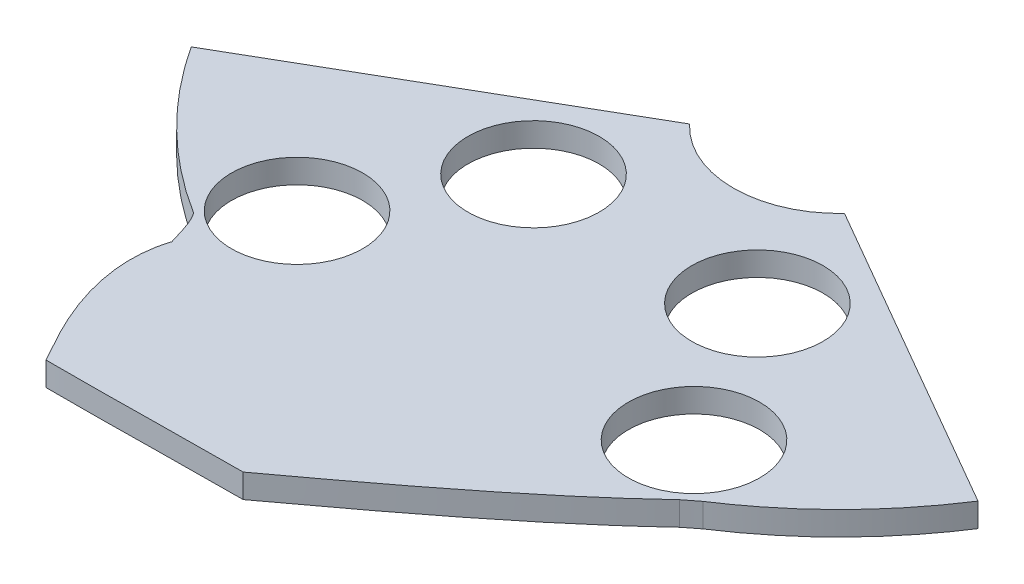
ISO-10303-21;
HEADER;
FILE_DESCRIPTION(('STEP AP214'),'2;1');
FILE_NAME('part.step','',(''),(''),'','','');
FILE_SCHEMA(('AUTOMOTIVE_DESIGN { 1 0 10303 214 1 1 1 1 }'));
ENDSEC;
DATA;
#1=APPLICATION_CONTEXT('core data for automotive mechanical design processes');
#2=APPLICATION_PROTOCOL_DEFINITION('international standard','automotive_design',2000,#1);
#3=PRODUCT_CONTEXT('',#1,'mechanical');
#4=PRODUCT('Part','Part','',(#3));
#5=PRODUCT_RELATED_PRODUCT_CATEGORY('part','',(#4));
#6=PRODUCT_DEFINITION_FORMATION('','',#4);
#7=PRODUCT_DEFINITION_CONTEXT('part definition',#1,'design');
#8=PRODUCT_DEFINITION('design','',#6,#7);
#9=PRODUCT_DEFINITION_SHAPE('','',#8);
#10=(LENGTH_UNIT() NAMED_UNIT(*) SI_UNIT(.MILLI.,.METRE.));
#11=(NAMED_UNIT(*) PLANE_ANGLE_UNIT() SI_UNIT($,.RADIAN.));
#12=(NAMED_UNIT(*) SI_UNIT($,.STERADIAN.) SOLID_ANGLE_UNIT());
#13=UNCERTAINTY_MEASURE_WITH_UNIT(LENGTH_MEASURE(1.E-05),#10,'distance_accuracy_value','');
#14=(GEOMETRIC_REPRESENTATION_CONTEXT(3) GLOBAL_UNCERTAINTY_ASSIGNED_CONTEXT((#13)) GLOBAL_UNIT_ASSIGNED_CONTEXT((#10,
#11,#12)) REPRESENTATION_CONTEXT('',''));
#15=CARTESIAN_POINT('',(0.,0.,0.));
#16=DIRECTION('',(0.,0.,1.));
#17=DIRECTION('',(1.,0.,0.));
#18=AXIS2_PLACEMENT_3D('',#15,#16,#17);
#19=CARTESIAN_POINT('',(-55.0520473472876,-87.736,55.9596318236398));
#20=DIRECTION('',(0.,-1.,0.));
#21=DIRECTION('',(0.,0.,-1.));
#22=AXIS2_PLACEMENT_3D('',#19,#20,#21);
#23=PLANE('',#22);
#24=CARTESIAN_POINT('',(18.75,-87.736,32.476));
#25=DIRECTION('',(0.,-1.,0.));
#26=DIRECTION('',(0.,0.,-1.));
#27=AXIS2_PLACEMENT_3D('',#24,#25,#26);
#28=CIRCLE('',#27,10.999845998306);
#29=CARTESIAN_POINT('',(18.75,-87.736,21.476154001694));
#30=VERTEX_POINT('',#29);
#31=EDGE_CURVE('E441',#30,#30,#28,.T.);
#32=ORIENTED_EDGE('',*,*,#31,.F.);
#33=EDGE_LOOP('',(#32));
#34=FACE_BOUND('',#33,.T.);
#35=CARTESIAN_POINT('',(-33.25,-87.736,57.591));
#36=DIRECTION('',(0.,-1.,0.));
#37=DIRECTION('',(0.,0.,-1.));
#38=AXIS2_PLACEMENT_3D('',#35,#36,#37);
#39=CIRCLE('',#38,10.999845998306);
#40=CARTESIAN_POINT('',(-33.25,-87.736,46.591154001694));
#41=VERTEX_POINT('',#40);
#42=EDGE_CURVE('E422',#41,#41,#39,.T.);
#43=ORIENTED_EDGE('',*,*,#42,.F.);
#44=EDGE_LOOP('',(#43));
#45=FACE_BOUND('',#44,.T.);
#46=CARTESIAN_POINT('',(-65.8942438215736,-87.736,42.6629141284689));
#47=CARTESIAN_POINT('',(-64.3363717966949,-87.736,45.0682384546903));
#48=CARTESIAN_POINT('',(-62.6479617907851,-87.736,47.389191956751));
#49=CARTESIAN_POINT('',(-59.0277869117494,-87.736,51.8287368815208));
#50=CARTESIAN_POINT('',(-57.0946274292506,-87.736,53.9500653699306));
#51=CARTESIAN_POINT('',(-50.9669001434117,-87.736,59.9787519804776));
#52=CARTESIAN_POINT('',(-46.4412354467479,-87.736,63.5473498690072));
#53=CARTESIAN_POINT('',(-41.5808535684729,-87.736,66.5829540394576));
#54=B_SPLINE_CURVE_WITH_KNOTS('',3,(#46,#47,#48,#49,#50,#51,#52,#53),.UNSPECIFIED.,.F.,.F.,(4,2,
2,4),(1.58623522583667E-06,0.250001586235226,0.500001586235226,1.),.UNSPECIFIED.);
#55=CARTESIAN_POINT('',(-41.5808535687203,-87.736,66.5829540398534));
#56=VERTEX_POINT('',#55);
#57=CARTESIAN_POINT('',(-65.8942438215736,-87.736,42.6629141284689));
#58=VERTEX_POINT('',#57);
#59=EDGE_CURVE('E378',#56,#58,#54,.F.);
#60=ORIENTED_EDGE('',*,*,#59,.T.);
#61=DIRECTION('',(0.866025113443951,0.,-0.500000502884139));
#62=VECTOR('',#61,1.);
#63=CARTESIAN_POINT('',(-65.8942438215736,-87.736,42.6629141284689));
#64=LINE('',#63,#62);
#65=CARTESIAN_POINT('',(-12.9766531358799,-87.736,12.1108879302399));
#66=VERTEX_POINT('',#65);
#67=EDGE_CURVE('E103',#58,#66,#64,.T.);
#68=ORIENTED_EDGE('',*,*,#67,.T.);
#69=CARTESIAN_POINT('',(0.,-87.736,0.));
#70=DIRECTION('',(0.,1.,0.));
#71=DIRECTION('',(0.,0.,-1.));
#72=AXIS2_PLACEMENT_3D('',#69,#70,#71);
#73=CIRCLE('',#72,17.7501305084715);
#74=CARTESIAN_POINT('',(12.9766531358511,-87.736,12.1108879302707));
#75=VERTEX_POINT('',#74);
#76=EDGE_CURVE('E272',#66,#75,#73,.T.);
#77=ORIENTED_EDGE('',*,*,#76,.T.);
#78=DIRECTION('',(0.866025113442766,0.,0.500000502886192));
#79=VECTOR('',#78,1.);
#80=CARTESIAN_POINT('',(12.9766531358511,-87.736,12.1108879302707));
#81=LINE('',#80,#79);
#82=CARTESIAN_POINT('',(65.8946490574718,-87.736,42.6631480920524));
#83=VERTEX_POINT('',#82);
#84=EDGE_CURVE('E249',#75,#83,#81,.T.);
#85=ORIENTED_EDGE('',*,*,#84,.T.);
#86=CARTESIAN_POINT('',(42.8828039857901,-87.736,65.7521102612512));
#87=CARTESIAN_POINT('',(45.1737617508951,-87.736,64.2582041185947));
#88=CARTESIAN_POINT('',(47.3877951781587,-87.736,62.6417764447803));
#89=CARTESIAN_POINT('',(51.6362570394499,-87.736,59.1896560975365));
#90=CARTESIAN_POINT('',(53.6692311857068,-87.736,57.3534712630623));
#91=CARTESIAN_POINT('',(59.4648172289766,-87.736,51.5394550472412));
#92=CARTESIAN_POINT('',(62.9203197673447,-87.736,47.2575045112625));
#93=CARTESIAN_POINT('',(65.8946490574718,-87.736,42.6631480920524));
#94=B_SPLINE_CURVE_WITH_KNOTS('',3,(#86,#87,#88,#89,#90,#91,#92,#93),.UNSPECIFIED.,.F.,.F.,(4,2,
2,4),(0.,0.25,0.5,1.),.UNSPECIFIED.);
#95=CARTESIAN_POINT('',(42.8828039857901,-87.736,65.7521102612512));
#96=VERTEX_POINT('',#95);
#97=EDGE_CURVE('E244',#83,#96,#94,.F.);
#98=ORIENTED_EDGE('',*,*,#97,.T.);
#99=CARTESIAN_POINT('',(40.7004704810684,-87.736,67.4575422626576));
#100=CARTESIAN_POINT('',(40.8867616398878,-87.736,67.3087391992329));
#101=CARTESIAN_POINT('',(41.2496543915723,-87.736,67.0188754356988));
#102=CARTESIAN_POINT('',(41.7979280683242,-87.736,66.5881386882111));
#103=CARTESIAN_POINT('',(42.3385373369795,-87.736,66.1677438511575));
#104=CARTESIAN_POINT('',(42.7031747811597,-87.736,65.889285515214));
#105=CARTESIAN_POINT('',(42.8828036072188,-87.736,65.7521105081207));
#106=B_SPLINE_CURVE_WITH_KNOTS('',3,(#99,#100,#101,#102,#103,#104,#105),.UNSPECIFIED.,.F.,.F.,
(4,1,1,1,4),(0.,0.258173576911872,0.502916972355743,0.754983436937178,0.999720160996087),.UNSPECIFIED.);
#107=CARTESIAN_POINT('',(40.7004704810684,-87.736,67.4575422626577));
#108=VERTEX_POINT('',#107);
#109=EDGE_CURVE('E321',#96,#108,#106,.F.);
#110=ORIENTED_EDGE('',*,*,#109,.T.);
#111=CARTESIAN_POINT('',(0.131067464151984,-87.7359999999999,99.9999693253625));
#112=CARTESIAN_POINT('',(1.51107387595093,-87.7359999999999,98.9848313259104));
#113=CARTESIAN_POINT('',(4.51609838661675,-87.7359999999999,96.7743237920469));
#114=CARTESIAN_POINT('',(8.82690411870411,-87.736,93.5687154434641));
#115=CARTESIAN_POINT('',(12.6236885784628,-87.736,90.7089565437726));
#116=CARTESIAN_POINT('',(15.6690907022038,-87.736,88.385653659053));
#117=CARTESIAN_POINT('',(18.9171375943103,-87.736,85.8803711852998));
#118=CARTESIAN_POINT('',(22.7896384570573,-87.736,82.841797706014));
#119=CARTESIAN_POINT('',(26.4480459632341,-87.736,79.8917970907487));
#120=CARTESIAN_POINT('',(29.3960302704276,-87.736,77.4550232048664));
#121=CARTESIAN_POINT('',(31.6397966991165,-87.736,75.565580219963));
#122=CARTESIAN_POINT('',(33.8721449515672,-87.736,73.6432908249523));
#123=CARTESIAN_POINT('',(35.6436157034548,-87.736,72.0832953923408));
#124=CARTESIAN_POINT('',(36.9680411924613,-87.736,70.8973496369327));
#125=CARTESIAN_POINT('',(37.9477097741701,-87.736,70.010038492036));
#126=CARTESIAN_POINT('',(38.8948023414571,-87.736,69.1421063796165));
#127=CARTESIAN_POINT('',(39.8098411530025,-87.736,68.2945654110852));
#128=CARTESIAN_POINT('',(40.4066282874975,-87.736,67.7336978278344));
#129=CARTESIAN_POINT('',(40.7004704810684,-87.736,67.4575422626577));
#130=B_SPLINE_CURVE_WITH_KNOTS('',3,(#111,#112,#113,#114,#115,#116,#117,#118,#119,#120,#121,
#122,#123,#124,#125,#126,#127,#128,#129),.UNSPECIFIED.,.F.,.F.,(4,1,1,1,1,1,1,1,1,1,1,1,1,1,1,1,
4),(-9.30362142148589E-06,0.0987502902813,0.215044045264264,0.309674643517004,0.372764322258113,
0.435858284457049,0.546143036680816,0.656517674997856,0.706768770349083,0.766626982490989,
0.825614461856991,0.876591601837197,0.902698147445452,0.9280998717604,0.95278792018582,
0.976754052333753,0.999999999999996),.UNSPECIFIED.);
#131=CARTESIAN_POINT('',(0.131067464151832,-87.736,99.9999693253626));
#132=VERTEX_POINT('',#131);
#133=EDGE_CURVE('E129',#108,#132,#130,.F.);
#134=ORIENTED_EDGE('',*,*,#133,.T.);
#135=CARTESIAN_POINT('',(0.131064335761434,-87.736,99.9999693257229));
#136=CARTESIAN_POINT('',(0.087384425976382,-87.736,99.9999743126418));
#137=CARTESIAN_POINT('',(-10.7690040149646,-87.736,100.002511242271));
#138=CARTESIAN_POINT('',(-22.1308541684504,-87.736,100.330427039868));
#139=CARTESIAN_POINT('',(-32.639145671124,-87.736,100.264269814892));
#140=B_SPLINE_CURVE_WITH_KNOTS('',3,(#135,#136,#137,#138,#139),.UNSPECIFIED.,.F.,.F.,(4,1,4),
(0.,0.00402418543561504,1.),.UNSPECIFIED.);
#141=CARTESIAN_POINT('',(-32.639145671124,-87.736,100.264269814892));
#142=VERTEX_POINT('',#141);
#143=EDGE_CURVE('E122',#132,#142,#140,.T.);
#144=ORIENTED_EDGE('',*,*,#143,.T.);
#145=CARTESIAN_POINT('',(-39.2579138546466,-87.736,72.5609008614316));
#146=CARTESIAN_POINT('',(-39.3334243155988,-87.736,72.8026256264214));
#147=CARTESIAN_POINT('',(-39.4847579417553,-87.736,73.2870779113807));
#148=CARTESIAN_POINT('',(-39.6702803341601,-87.736,74.0275991301665));
#149=CARTESIAN_POINT('',(-39.8267682491792,-87.736,74.7785722841445));
#150=CARTESIAN_POINT('',(-39.9517779760452,-87.736,75.5401641651443));
#151=CARTESIAN_POINT('',(-40.1176189518085,-87.736,76.8864325125948));
#152=CARTESIAN_POINT('',(-40.1972551985473,-87.736,78.8684086676542));
#153=CARTESIAN_POINT('',(-40.0491348770359,-87.736,81.0085004298021));
#154=CARTESIAN_POINT('',(-39.8067322982257,-87.736,82.7289881524763));
#155=CARTESIAN_POINT('',(-39.4936561746402,-87.736,84.4197313871119));
#156=CARTESIAN_POINT('',(-38.9728869992772,-87.736,86.5129325568522));
#157=CARTESIAN_POINT('',(-38.1806330891049,-87.736,88.961966327848));
#158=CARTESIAN_POINT('',(-37.4002248556766,-87.736,90.9529070416254));
#159=CARTESIAN_POINT('',(-36.7147243088933,-87.736,92.5152999311266));
#160=CARTESIAN_POINT('',(-35.9917866208589,-87.736,94.0608115741842));
#161=CARTESIAN_POINT('',(-35.0249931111153,-87.736,95.9649297903513));
#162=CARTESIAN_POINT('',(-33.8291369462771,-87.736,98.1525882755385));
#163=CARTESIAN_POINT('',(-33.0242403779927,-87.736,99.580914470401));
#164=CARTESIAN_POINT('',(-32.6391530384934,-87.736,100.264269768448));
#165=B_SPLINE_CURVE_WITH_KNOTS('',3,(#145,#146,#147,#148,#149,#150,#151,#152,#153,#154,#155,
#156,#157,#158,#159,#160,#161,#162,#163,#164),.UNSPECIFIED.,.F.,.F.,(4,1,1,1,1,1,1,1,1,1,1,1,1,
1,1,1,1,4),(0.,0.0259051117965361,0.0519176714200895,0.0780650469227528,0.104370697989442,
0.130853537073552,0.216816719783621,0.306793467340347,0.349936613255063,0.394534777038986,
0.482664537785134,0.570393553242989,0.657709950962907,0.70132092011644,0.744937968127707,
0.832260593511006,0.91974781664861,0.999999082433621),.UNSPECIFIED.);
#166=CARTESIAN_POINT('',(-39.2579138546466,-87.736,72.5609008614316));
#167=VERTEX_POINT('',#166);
#168=EDGE_CURVE('E126',#142,#167,#165,.F.);
#169=ORIENTED_EDGE('',*,*,#168,.T.);
#170=CARTESIAN_POINT('',(-41.5808535687203,-87.736,66.5829540398534));
#171=CARTESIAN_POINT('',(-41.5319872719292,-87.736,66.6558028091556));
#172=CARTESIAN_POINT('',(-41.4353089611126,-87.736,66.7999286468578));
#173=CARTESIAN_POINT('',(-41.2995809981519,-87.736,67.018827268487));
#174=CARTESIAN_POINT('',(-41.1462861887753,-87.736,67.2811092135757));
#175=CARTESIAN_POINT('',(-40.9785526023332,-87.736,67.5935523964576));
#176=CARTESIAN_POINT('',(-40.7476876188367,-87.736,68.0691830135567));
#177=CARTESIAN_POINT('',(-40.4857920797012,-87.736,68.6962659882754));
#178=CARTESIAN_POINT('',(-40.2160589852076,-87.736,69.4655545456486));
#179=CARTESIAN_POINT('',(-39.9718734688118,-87.736,70.2581110771085));
#180=CARTESIAN_POINT('',(-39.7422106096374,-87.736,71.0423321668089));
#181=CARTESIAN_POINT('',(-39.5488207806256,-87.736,71.6845690757876));
#182=CARTESIAN_POINT('',(-39.3857613534492,-87.736,72.1903015127027));
#183=CARTESIAN_POINT('',(-39.3013057405258,-87.736,72.4351178781961));
#184=CARTESIAN_POINT('',(-39.2579138546466,-87.736,72.5609008614316));
#185=B_SPLINE_CURVE_WITH_KNOTS('',3,(#170,#171,#172,#173,#174,#175,#176,#177,#178,#179,#180,
#181,#182,#183,#184),.UNSPECIFIED.,.F.,.F.,(4,1,1,1,1,1,1,1,1,1,1,1,4),(3.57647245152748E-12,
0.0408612084883788,0.0808408427582133,0.119959497415701,0.182369139619358,0.245982243098387,
0.366190626170423,0.498693620001761,0.625589055555227,0.752485689292335,0.879367333769634,
0.938023711923866,1.00000606410009),.UNSPECIFIED.);
#186=EDGE_CURVE('E51',#167,#56,#185,.F.);
#187=ORIENTED_EDGE('',*,*,#186,.T.);
#188=EDGE_LOOP('',(#60,#68,#77,#85,#98,#110,#134,#144,#169,#187));
#189=FACE_BOUND('',#188,.T.);
#190=CARTESIAN_POINT('',(33.25,-87.736,57.591));
#191=DIRECTION('',(0.,-1.,0.));
#192=DIRECTION('',(0.,0.,-1.));
#193=AXIS2_PLACEMENT_3D('',#190,#191,#192);
#194=CIRCLE('',#193,10.999845998306);
#195=CARTESIAN_POINT('',(33.25,-87.736,46.591154001694));
#196=VERTEX_POINT('',#195);
#197=EDGE_CURVE('E429',#196,#196,#194,.T.);
#198=ORIENTED_EDGE('',*,*,#197,.F.);
#199=EDGE_LOOP('',(#198));
#200=FACE_BOUND('',#199,.T.);
#201=CARTESIAN_POINT('',(-18.75,-87.736,32.476));
#202=DIRECTION('',(0.,-1.,0.));
#203=DIRECTION('',(0.,0.,-1.));
#204=AXIS2_PLACEMENT_3D('',#201,#202,#203);
#205=CIRCLE('',#204,10.999845998306);
#206=CARTESIAN_POINT('',(-18.75,-87.736,21.476154001694));
#207=VERTEX_POINT('',#206);
#208=EDGE_CURVE('E447',#207,#207,#205,.T.);
#209=ORIENTED_EDGE('',*,*,#208,.F.);
#210=EDGE_LOOP('',(#209));
#211=FACE_BOUND('',#210,.T.);
#212=ADVANCED_FACE('F30',(#34,#45,#189,#200,#211),#23,.T.);
#213=CARTESIAN_POINT('',(-55.0520473472876,-83.736,55.9596318236398));
#214=DIRECTION('',(0.,-1.,0.));
#215=DIRECTION('',(0.,0.,-1.));
#216=AXIS2_PLACEMENT_3D('',#213,#214,#215);
#217=PLANE('',#216);
#218=CARTESIAN_POINT('',(18.75,-83.736,32.476));
#219=DIRECTION('',(0.,-1.,0.));
#220=DIRECTION('',(0.,0.,-1.));
#221=AXIS2_PLACEMENT_3D('',#218,#219,#220);
#222=CIRCLE('',#221,10.999845998306);
#223=CARTESIAN_POINT('',(18.75,-83.736,21.476154001694));
#224=VERTEX_POINT('',#223);
#225=EDGE_CURVE('E444',#224,#224,#222,.T.);
#226=ORIENTED_EDGE('',*,*,#225,.T.);
#227=EDGE_LOOP('',(#226));
#228=FACE_BOUND('',#227,.T.);
#229=CARTESIAN_POINT('',(-33.25,-83.736,57.591));
#230=DIRECTION('',(0.,-1.,0.));
#231=DIRECTION('',(0.,0.,-1.));
#232=AXIS2_PLACEMENT_3D('',#229,#230,#231);
#233=CIRCLE('',#232,10.999845998306);
#234=CARTESIAN_POINT('',(-33.25,-83.736,46.591154001694));
#235=VERTEX_POINT('',#234);
#236=EDGE_CURVE('E424',#235,#235,#233,.T.);
#237=ORIENTED_EDGE('',*,*,#236,.T.);
#238=EDGE_LOOP('',(#237));
#239=FACE_BOUND('',#238,.T.);
#240=CARTESIAN_POINT('',(-41.5808535684729,-83.736,66.5829540394576));
#241=CARTESIAN_POINT('',(-46.4412354467479,-83.736,63.5473498690072));
#242=CARTESIAN_POINT('',(-50.9669001434117,-83.736,59.9787519804776));
#243=CARTESIAN_POINT('',(-57.0946274292506,-83.736,53.9500653699306));
#244=CARTESIAN_POINT('',(-59.0277869117494,-83.736,51.8287368815208));
#245=CARTESIAN_POINT('',(-62.6479617907851,-83.736,47.389191956751));
#246=CARTESIAN_POINT('',(-64.3363717966949,-83.736,45.0682384546903));
#247=CARTESIAN_POINT('',(-65.8942438215736,-83.736,42.6629141284689));
#248=B_SPLINE_CURVE_WITH_KNOTS('',3,(#240,#241,#242,#243,#244,#245,#246,#247),.UNSPECIFIED.,.F.,
.F.,(4,2,2,4),(1.58623522587787E-06,0.5,0.75,1.),.UNSPECIFIED.);
#249=CARTESIAN_POINT('',(-41.5808535687203,-83.736,66.5829540398534));
#250=VERTEX_POINT('',#249);
#251=CARTESIAN_POINT('',(-65.8942438215736,-83.736,42.6629141284689));
#252=VERTEX_POINT('',#251);
#253=EDGE_CURVE('E405',#250,#252,#248,.T.);
#254=ORIENTED_EDGE('',*,*,#253,.F.);
#255=CARTESIAN_POINT('',(-39.2579138546466,-83.736,72.5609008614316));
#256=CARTESIAN_POINT('',(-39.3013057405258,-83.736,72.4351178781961));
#257=CARTESIAN_POINT('',(-39.3857613534492,-83.736,72.1903015127027));
#258=CARTESIAN_POINT('',(-39.5488207806256,-83.736,71.6845690757876));
#259=CARTESIAN_POINT('',(-39.7422106096374,-83.736,71.0423321668089));
#260=CARTESIAN_POINT('',(-39.9718734688118,-83.736,70.2581110771085));
#261=CARTESIAN_POINT('',(-40.2160589852076,-83.736,69.4655545456486));
#262=CARTESIAN_POINT('',(-40.4857920797012,-83.736,68.6962659882754));
#263=CARTESIAN_POINT('',(-40.7476876188367,-83.736,68.0691830135567));
#264=CARTESIAN_POINT('',(-40.9785526023332,-83.736,67.5935523964576));
#265=CARTESIAN_POINT('',(-41.1462861887753,-83.736,67.2811092135757));
#266=CARTESIAN_POINT('',(-41.2995809981519,-83.736,67.018827268487));
#267=CARTESIAN_POINT('',(-41.4353089611126,-83.736,66.7999286468578));
#268=CARTESIAN_POINT('',(-41.5319872719292,-83.736,66.6558028091556));
#269=CARTESIAN_POINT('',(-41.5808535687203,-83.736,66.5829540398534));
#270=B_SPLINE_CURVE_WITH_KNOTS('',3,(#255,#256,#257,#258,#259,#260,#261,#262,#263,#264,#265,
#266,#267,#268,#269),.UNSPECIFIED.,.F.,.F.,(4,1,1,1,1,1,1,1,1,1,1,1,4),(3.57652777521973E-12,
0.0619823521797978,0.12063873033403,0.247520374811329,0.374417008548437,0.501312444101903,
0.633815437933241,0.754023821005277,0.817636924484306,0.880046566687963,0.919165221345451,
0.959144855615285,1.00000606410009),.UNSPECIFIED.);
#271=CARTESIAN_POINT('',(-39.2579138546466,-83.736,72.5609008614316));
#272=VERTEX_POINT('',#271);
#273=EDGE_CURVE('E94',#272,#250,#270,.T.);
#274=ORIENTED_EDGE('',*,*,#273,.F.);
#275=CARTESIAN_POINT('',(-32.6391530384934,-83.736,100.264269768448));
#276=CARTESIAN_POINT('',(-33.0242403779927,-83.736,99.580914470401));
#277=CARTESIAN_POINT('',(-33.8291369462771,-83.736,98.1525882755385));
#278=CARTESIAN_POINT('',(-35.0249931111153,-83.736,95.9649297903513));
#279=CARTESIAN_POINT('',(-35.9917866208589,-83.736,94.0608115741842));
#280=CARTESIAN_POINT('',(-36.7147243088933,-83.736,92.5152999311266));
#281=CARTESIAN_POINT('',(-37.4002248556766,-83.736,90.9529070416254));
#282=CARTESIAN_POINT('',(-38.1806330891049,-83.736,88.961966327848));
#283=CARTESIAN_POINT('',(-38.9728869992772,-83.736,86.5129325568522));
#284=CARTESIAN_POINT('',(-39.4936561746402,-83.736,84.4197313871119));
#285=CARTESIAN_POINT('',(-39.8067322982257,-83.736,82.7289881524763));
#286=CARTESIAN_POINT('',(-40.0491348770359,-83.736,81.0085004298021));
#287=CARTESIAN_POINT('',(-40.1972551985473,-83.736,78.8684086676542));
#288=CARTESIAN_POINT('',(-40.1176189518085,-83.736,76.8864325125948));
#289=CARTESIAN_POINT('',(-39.9517779760452,-83.736,75.5401641651443));
#290=CARTESIAN_POINT('',(-39.8267682491792,-83.736,74.7785722841445));
#291=CARTESIAN_POINT('',(-39.6702803341601,-83.736,74.0275991301665));
#292=CARTESIAN_POINT('',(-39.4847579417553,-83.736,73.2870779113807));
#293=CARTESIAN_POINT('',(-39.3334243155988,-83.736,72.8026256264214));
#294=CARTESIAN_POINT('',(-39.2579138546466,-83.736,72.5609008614316));
#295=B_SPLINE_CURVE_WITH_KNOTS('',3,(#275,#276,#277,#278,#279,#280,#281,#282,#283,#284,#285,
#286,#287,#288,#289,#290,#291,#292,#293,#294),.UNSPECIFIED.,.F.,.F.,(4,1,1,1,1,1,1,1,1,1,1,1,1,
1,1,1,1,4),(0.,0.0802512657850111,0.167738488922615,0.255061114305913,0.298678162317181,
0.342289131470714,0.429605529190632,0.517334544648486,0.605464305394635,0.650062469178558,
0.693205615093274,0.78318236265,0.869145545360069,0.895628384444179,0.921934035510868,
0.948081411013531,0.974093970637085,0.999999082433621),.UNSPECIFIED.);
#296=CARTESIAN_POINT('',(-32.639145671124,-83.736,100.264269814892));
#297=VERTEX_POINT('',#296);
#298=EDGE_CURVE('E87',#297,#272,#295,.T.);
#299=ORIENTED_EDGE('',*,*,#298,.F.);
#300=CARTESIAN_POINT('',(0.131064335761434,-83.736,99.9999693257229));
#301=CARTESIAN_POINT('',(0.087384425976382,-83.736,99.9999743126418));
#302=CARTESIAN_POINT('',(-10.7690040149646,-83.736,100.002511242271));
#303=CARTESIAN_POINT('',(-22.1308541684504,-83.736,100.330427039868));
#304=CARTESIAN_POINT('',(-32.639145671124,-83.736,100.264269814892));
#305=B_SPLINE_CURVE_WITH_KNOTS('',3,(#300,#301,#302,#303,#304),.UNSPECIFIED.,.F.,.F.,(4,1,4),
(0.,0.00402418543561504,1.),.UNSPECIFIED.);
#306=CARTESIAN_POINT('',(0.131067464151832,-83.736,99.9999693253626));
#307=VERTEX_POINT('',#306);
#308=EDGE_CURVE('E138',#307,#297,#305,.T.);
#309=ORIENTED_EDGE('',*,*,#308,.F.);
#310=CARTESIAN_POINT('',(40.7004704810684,-83.736,67.4575422626577));
#311=CARTESIAN_POINT('',(40.4066282874975,-83.736,67.7336978278344));
#312=CARTESIAN_POINT('',(39.8098411530025,-83.736,68.2945654110852));
#313=CARTESIAN_POINT('',(38.8948023414571,-83.736,69.1421063796165));
#314=CARTESIAN_POINT('',(37.9477097741701,-83.736,70.010038492036));
#315=CARTESIAN_POINT('',(36.9680411924613,-83.736,70.8973496369327));
#316=CARTESIAN_POINT('',(35.6436157034548,-83.736,72.0832953923408));
#317=CARTESIAN_POINT('',(33.8721449515672,-83.736,73.6432908249523));
#318=CARTESIAN_POINT('',(31.6397966991165,-83.736,75.565580219963));
#319=CARTESIAN_POINT('',(29.3960302704276,-83.736,77.4550232048664));
#320=CARTESIAN_POINT('',(26.4480459632341,-83.736,79.8917970907487));
#321=CARTESIAN_POINT('',(22.7896384570573,-83.736,82.841797706014));
#322=CARTESIAN_POINT('',(18.9171375943103,-83.736,85.8803711852998));
#323=CARTESIAN_POINT('',(15.6690907022038,-83.736,88.385653659053));
#324=CARTESIAN_POINT('',(12.6236885784628,-83.736,90.7089565437726));
#325=CARTESIAN_POINT('',(8.82690411870411,-83.736,93.5687154434641));
#326=CARTESIAN_POINT('',(4.51609838661675,-83.7359999999999,96.7743237920469));
#327=CARTESIAN_POINT('',(1.51107387595093,-83.7359999999999,98.9848313259104));
#328=CARTESIAN_POINT('',(0.131067464151984,-83.7359999999999,99.9999693253625));
#329=B_SPLINE_CURVE_WITH_KNOTS('',3,(#310,#311,#312,#313,#314,#315,#316,#317,#318,#319,#320,
#321,#322,#323,#324,#325,#326,#327,#328),.UNSPECIFIED.,.F.,.F.,(4,1,1,1,1,1,1,1,1,1,1,1,1,1,1,1,
4),(-9.30362142148463E-06,0.0232366440448214,0.047202776192755,0.0718908246181746,
0.0972925489331226,0.123399094541377,0.174376234521584,0.233363713887585,0.293221926029491,
0.343473021380718,0.453847659697759,0.564132411921526,0.627226374120462,0.69031605286157,
0.78494665111431,0.901240406097275,0.999999999999996),.UNSPECIFIED.);
#330=CARTESIAN_POINT('',(40.7004704810684,-83.736,67.4575422626577));
#331=VERTEX_POINT('',#330);
#332=EDGE_CURVE('E312',#331,#307,#329,.T.);
#333=ORIENTED_EDGE('',*,*,#332,.F.);
#334=CARTESIAN_POINT('',(42.8828036072188,-83.736,65.7521105081207));
#335=CARTESIAN_POINT('',(42.7031747811597,-83.736,65.889285515214));
#336=CARTESIAN_POINT('',(42.3385373369795,-83.736,66.1677438511575));
#337=CARTESIAN_POINT('',(41.7979280683242,-83.736,66.5881386882111));
#338=CARTESIAN_POINT('',(41.2496543915723,-83.736,67.0188754356988));
#339=CARTESIAN_POINT('',(40.8867616398878,-83.736,67.3087391992329));
#340=CARTESIAN_POINT('',(40.7004704810684,-83.736,67.4575422626576));
#341=B_SPLINE_CURVE_WITH_KNOTS('',3,(#334,#335,#336,#337,#338,#339,#340),.UNSPECIFIED.,.F.,.F.,
(4,1,1,1,4),(0.,0.244736724058909,0.496803188640344,0.741546584084215,0.999720160996087),.UNSPECIFIED.);
#342=CARTESIAN_POINT('',(42.8828039857901,-83.736,65.7521102612512));
#343=VERTEX_POINT('',#342);
#344=EDGE_CURVE('E327',#343,#331,#341,.T.);
#345=ORIENTED_EDGE('',*,*,#344,.F.);
#346=CARTESIAN_POINT('',(65.8946490574718,-83.736,42.6631480920524));
#347=CARTESIAN_POINT('',(62.9203197673447,-83.736,47.2575045112625));
#348=CARTESIAN_POINT('',(59.4648172289766,-83.736,51.5394550472412));
#349=CARTESIAN_POINT('',(53.6692311857068,-83.736,57.3534712630623));
#350=CARTESIAN_POINT('',(51.6362570394499,-83.736,59.1896560975365));
#351=CARTESIAN_POINT('',(47.3877951781587,-83.736,62.6417764447803));
#352=CARTESIAN_POINT('',(45.1737617508951,-83.736,64.2582041185947));
#353=CARTESIAN_POINT('',(42.8828039857901,-83.736,65.7521102612512));
#354=B_SPLINE_CURVE_WITH_KNOTS('',3,(#346,#347,#348,#349,#350,#351,#352,#353),.UNSPECIFIED.,.F.,
.F.,(4,2,2,4),(0.,0.5,0.75,1.),.UNSPECIFIED.);
#355=CARTESIAN_POINT('',(65.8946490574718,-83.736,42.6631480920524));
#356=VERTEX_POINT('',#355);
#357=EDGE_CURVE('E363',#356,#343,#354,.T.);
#358=ORIENTED_EDGE('',*,*,#357,.F.);
#359=DIRECTION('',(0.866025113442766,0.,0.500000502886192));
#360=VECTOR('',#359,1.);
#361=CARTESIAN_POINT('',(12.9766531358511,-83.736,12.1108879302707));
#362=LINE('',#361,#360);
#363=CARTESIAN_POINT('',(12.9766531358511,-83.736,12.1108879302707));
#364=VERTEX_POINT('',#363);
#365=EDGE_CURVE('E188',#364,#356,#362,.T.);
#366=ORIENTED_EDGE('',*,*,#365,.F.);
#367=CARTESIAN_POINT('',(0.,-83.736,0.));
#368=DIRECTION('',(0.,1.,0.));
#369=DIRECTION('',(0.,0.,-1.));
#370=AXIS2_PLACEMENT_3D('',#367,#368,#369);
#371=CIRCLE('',#370,17.7501305084715);
#372=CARTESIAN_POINT('',(-12.9766531358799,-83.736,12.1108879302399));
#373=VERTEX_POINT('',#372);
#374=EDGE_CURVE('E183',#373,#364,#371,.T.);
#375=ORIENTED_EDGE('',*,*,#374,.F.);
#376=DIRECTION('',(0.866025113443951,0.,-0.500000502884139));
#377=VECTOR('',#376,1.);
#378=CARTESIAN_POINT('',(-65.8942438215736,-83.736,42.6629141284689));
#379=LINE('',#378,#377);
#380=EDGE_CURVE('E189',#252,#373,#379,.T.);
#381=ORIENTED_EDGE('',*,*,#380,.F.);
#382=EDGE_LOOP('',(#254,#274,#299,#309,#333,#345,#358,#366,#375,#381));
#383=FACE_BOUND('',#382,.T.);
#384=CARTESIAN_POINT('',(33.25,-83.736,57.591));
#385=DIRECTION('',(0.,-1.,0.));
#386=DIRECTION('',(0.,0.,-1.));
#387=AXIS2_PLACEMENT_3D('',#384,#385,#386);
#388=CIRCLE('',#387,10.999845998306);
#389=CARTESIAN_POINT('',(33.25,-83.736,46.591154001694));
#390=VERTEX_POINT('',#389);
#391=EDGE_CURVE('E432',#390,#390,#388,.T.);
#392=ORIENTED_EDGE('',*,*,#391,.T.);
#393=EDGE_LOOP('',(#392));
#394=FACE_BOUND('',#393,.T.);
#395=CARTESIAN_POINT('',(-18.75,-83.736,32.476));
#396=DIRECTION('',(0.,-1.,0.));
#397=DIRECTION('',(0.,0.,-1.));
#398=AXIS2_PLACEMENT_3D('',#395,#396,#397);
#399=CIRCLE('',#398,10.999845998306);
#400=CARTESIAN_POINT('',(-18.75,-83.736,21.476154001694));
#401=VERTEX_POINT('',#400);
#402=EDGE_CURVE('E450',#401,#401,#399,.T.);
#403=ORIENTED_EDGE('',*,*,#402,.T.);
#404=EDGE_LOOP('',(#403));
#405=FACE_BOUND('',#404,.T.);
#406=ADVANCED_FACE('F208',(#228,#239,#383,#394,#405),#217,.F.);
#407=CARTESIAN_POINT('',(-41.5808073100624,-87.736,66.5829829306268));
#408=CARTESIAN_POINT('',(-46.4412067315774,-87.736,63.5473725116172));
#409=CARTESIAN_POINT('',(-50.9668871833618,-87.736,59.978764731058));
#410=CARTESIAN_POINT('',(-57.0946274292506,-87.736,53.9500653699306));
#411=CARTESIAN_POINT('',(-59.0277869117494,-87.736,51.8287368815208));
#412=CARTESIAN_POINT('',(-62.6479617907851,-87.736,47.389191956751));
#413=CARTESIAN_POINT('',(-64.3363717966949,-87.736,45.0682384546903));
#414=CARTESIAN_POINT('',(-65.8942438215736,-87.736,42.6629141284689));
#415=B_SPLINE_CURVE_WITH_KNOTS('',3,(#407,#408,#409,#410,#411,#412,#413,#414),.UNSPECIFIED.,.F.,
.F.,(4,2,2,4),(0.,0.5,0.75,1.),.UNSPECIFIED.);
#416=DIRECTION('',(0.,1.,0.));
#417=VECTOR('',#416,1.);
#418=SURFACE_OF_LINEAR_EXTRUSION('',#415,#417);
#419=ORIENTED_EDGE('',*,*,#253,.T.);
#420=DIRECTION('',(0.,1.,0.));
#421=VECTOR('',#420,1.);
#422=CARTESIAN_POINT('',(-65.8942438215736,-87.736,42.6629141284689));
#423=LINE('',#422,#421);
#424=EDGE_CURVE('E11',#58,#252,#423,.T.);
#425=ORIENTED_EDGE('',*,*,#424,.F.);
#426=ORIENTED_EDGE('',*,*,#59,.F.);
#427=DIRECTION('',(0.,1.,0.));
#428=VECTOR('',#427,1.);
#429=CARTESIAN_POINT('',(-41.5808535687203,-87.736,66.5829540398534));
#430=LINE('',#429,#428);
#431=EDGE_CURVE('E652',#56,#250,#430,.T.);
#432=ORIENTED_EDGE('',*,*,#431,.T.);
#433=EDGE_LOOP('',(#419,#425,#426,#432));
#434=FACE_BOUND('',#433,.T.);
#435=ADVANCED_FACE('F32',(#434),#418,.F.);
#436=CARTESIAN_POINT('',(-65.8942438215736,-87.736,42.6629141284689));
#437=DIRECTION('',(0.500000502884139,0.,0.866025113443951));
#438=DIRECTION('',(0.866025113443951,0.,-0.500000502884139));
#439=AXIS2_PLACEMENT_3D('',#436,#437,#438);
#440=PLANE('',#439);
#441=ORIENTED_EDGE('',*,*,#380,.T.);
#442=DIRECTION('',(0.,1.,0.));
#443=VECTOR('',#442,1.);
#444=CARTESIAN_POINT('',(-12.9766531358799,-87.736,12.1108879302399));
#445=LINE('',#444,#443);
#446=EDGE_CURVE('E42',#66,#373,#445,.T.);
#447=ORIENTED_EDGE('',*,*,#446,.F.);
#448=ORIENTED_EDGE('',*,*,#67,.F.);
#449=ORIENTED_EDGE('',*,*,#424,.T.);
#450=EDGE_LOOP('',(#441,#447,#448,#449));
#451=FACE_BOUND('',#450,.T.);
#452=ADVANCED_FACE('F469',(#451),#440,.F.);
#453=CARTESIAN_POINT('',(0.,-87.736,0.));
#454=DIRECTION('',(0.,1.,0.));
#455=DIRECTION('',(0.,0.,1.));
#456=AXIS2_PLACEMENT_3D('',#453,#454,#455);
#457=CYLINDRICAL_SURFACE('',#456,17.7501305084715);
#458=ORIENTED_EDGE('',*,*,#374,.T.);
#459=DIRECTION('',(0.,1.,0.));
#460=VECTOR('',#459,1.);
#461=CARTESIAN_POINT('',(12.9766531358511,-87.736,12.1108879302707));
#462=LINE('',#461,#460);
#463=EDGE_CURVE('E190',#75,#364,#462,.T.);
#464=ORIENTED_EDGE('',*,*,#463,.F.);
#465=ORIENTED_EDGE('',*,*,#76,.F.);
#466=ORIENTED_EDGE('',*,*,#446,.T.);
#467=EDGE_LOOP('',(#458,#464,#465,#466));
#468=FACE_BOUND('',#467,.T.);
#469=ADVANCED_FACE('F517',(#468),#457,.F.);
#470=CARTESIAN_POINT('',(12.9766531358511,-87.736,12.1108879302707));
#471=DIRECTION('',(-0.500000502886192,0.,0.866025113442766));
#472=DIRECTION('',(0.866025113442766,0.,0.500000502886192));
#473=AXIS2_PLACEMENT_3D('',#470,#471,#472);
#474=PLANE('',#473);
#475=ORIENTED_EDGE('',*,*,#365,.T.);
#476=DIRECTION('',(0.,1.,0.));
#477=VECTOR('',#476,1.);
#478=CARTESIAN_POINT('',(65.8946490574718,-87.736,42.6631480920524));
#479=LINE('',#478,#477);
#480=EDGE_CURVE('E193',#83,#356,#479,.T.);
#481=ORIENTED_EDGE('',*,*,#480,.F.);
#482=ORIENTED_EDGE('',*,*,#84,.F.);
#483=ORIENTED_EDGE('',*,*,#463,.T.);
#484=EDGE_LOOP('',(#475,#481,#482,#483));
#485=FACE_BOUND('',#484,.T.);
#486=ADVANCED_FACE('F263',(#485),#474,.F.);
#487=CARTESIAN_POINT('',(65.8946490574718,-87.736,42.6631480920524));
#488=CARTESIAN_POINT('',(62.9203197673447,-87.736,47.2575045112625));
#489=CARTESIAN_POINT('',(59.4648172289766,-87.736,51.5394550472412));
#490=CARTESIAN_POINT('',(53.6692311857068,-87.736,57.3534712630623));
#491=CARTESIAN_POINT('',(51.6362570394499,-87.736,59.1896560975365));
#492=CARTESIAN_POINT('',(47.3877951781587,-87.736,62.6417764447803));
#493=CARTESIAN_POINT('',(45.1737617508951,-87.736,64.2582041185947));
#494=CARTESIAN_POINT('',(42.8828039857901,-87.736,65.7521102612512));
#495=B_SPLINE_CURVE_WITH_KNOTS('',3,(#487,#488,#489,#490,#491,#492,#493,#494),.UNSPECIFIED.,.F.,
.F.,(4,2,2,4),(0.,0.5,0.75,1.),.UNSPECIFIED.);
#496=DIRECTION('',(0.,1.,0.));
#497=VECTOR('',#496,1.);
#498=SURFACE_OF_LINEAR_EXTRUSION('',#495,#497);
#499=ORIENTED_EDGE('',*,*,#357,.T.);
#500=DIRECTION('',(0.,1.,0.));
#501=VECTOR('',#500,1.);
#502=CARTESIAN_POINT('',(42.8828039857901,-87.736,65.7521102612512));
#503=LINE('',#502,#501);
#504=EDGE_CURVE('E329',#96,#343,#503,.T.);
#505=ORIENTED_EDGE('',*,*,#504,.F.);
#506=ORIENTED_EDGE('',*,*,#97,.F.);
#507=ORIENTED_EDGE('',*,*,#480,.T.);
#508=EDGE_LOOP('',(#499,#505,#506,#507));
#509=FACE_BOUND('',#508,.T.);
#510=ADVANCED_FACE('F251',(#509),#498,.F.);
#511=CARTESIAN_POINT('',(42.8828036072188,-87.736,65.7521105081207));
#512=CARTESIAN_POINT('',(42.7031747811597,-87.736,65.889285515214));
#513=CARTESIAN_POINT('',(42.3385373369795,-87.736,66.1677438511575));
#514=CARTESIAN_POINT('',(41.7979280683242,-87.736,66.5881386882111));
#515=CARTESIAN_POINT('',(41.2494511707438,-87.736,67.0190350907806));
#516=CARTESIAN_POINT('',(40.8863577904635,-87.736,67.3090617789826));
#517=CARTESIAN_POINT('',(40.6998647080128,-87.736,67.4580261336453));
#518=B_SPLINE_CURVE_WITH_KNOTS('',3,(#511,#512,#513,#514,#515,#516,#517),.UNSPECIFIED.,.F.,.F.,
(4,1,1,1,4),(0.,0.244736724058909,0.496803188640344,0.741546584084215,1.),.UNSPECIFIED.);
#519=DIRECTION('',(0.,1.,0.));
#520=VECTOR('',#519,1.);
#521=SURFACE_OF_LINEAR_EXTRUSION('',#518,#520);
#522=ORIENTED_EDGE('',*,*,#344,.T.);
#523=DIRECTION('',(0.,1.,0.));
#524=VECTOR('',#523,1.);
#525=CARTESIAN_POINT('',(40.7004704810684,-87.736,67.4575422626577));
#526=LINE('',#525,#524);
#527=EDGE_CURVE('E326',#108,#331,#526,.T.);
#528=ORIENTED_EDGE('',*,*,#527,.F.);
#529=ORIENTED_EDGE('',*,*,#109,.F.);
#530=ORIENTED_EDGE('',*,*,#504,.T.);
#531=EDGE_LOOP('',(#522,#528,#529,#530));
#532=FACE_BOUND('',#531,.T.);
#533=ADVANCED_FACE('F262',(#532),#521,.F.);
#534=CARTESIAN_POINT('',(1500.50102850044,-87.736,1432.21902968246));
#535=CARTESIAN_POINT('',(93.6717431644804,-87.736,-6.87719824363776));
#536=CARTESIAN_POINT('',(72.7726190520127,-87.736,37.7632870068118));
#537=CARTESIAN_POINT('',(38.8948023414571,-87.736,69.1421063796165));
#538=CARTESIAN_POINT('',(37.9477097741701,-87.736,70.010038492036));
#539=CARTESIAN_POINT('',(36.9680411924613,-87.736,70.8973496369327));
#540=CARTESIAN_POINT('',(35.6436157034548,-87.736,72.0832953923408));
#541=CARTESIAN_POINT('',(33.8721449515672,-87.736,73.6432908249523));
#542=CARTESIAN_POINT('',(31.6397966991165,-87.736,75.565580219963));
#543=CARTESIAN_POINT('',(29.3960302704276,-87.736,77.4550232048664));
#544=CARTESIAN_POINT('',(26.4480459632341,-87.736,79.8917970907487));
#545=CARTESIAN_POINT('',(22.7896384570573,-87.736,82.841797706014));
#546=CARTESIAN_POINT('',(18.9171375943103,-87.736,85.8803711852998));
#547=CARTESIAN_POINT('',(15.6690907022038,-87.736,88.385653659053));
#548=CARTESIAN_POINT('',(12.6236885784628,-87.736,90.7089565437726));
#549=CARTESIAN_POINT('',(8.82690411870411,-87.736,93.5687154434641));
#550=CARTESIAN_POINT('',(-102.908603106107,-87.736,176.657654508121));
#551=CARTESIAN_POINT('',(-228.943469896153,-87.736,237.599627776008));
#552=CARTESIAN_POINT('',(831.665785333413,-87.736,1903.57102820511));
#553=B_SPLINE_CURVE_WITH_KNOTS('',3,(#534,#535,#536,#537,#538,#539,#540,#541,#542,#543,#544,
#545,#546,#547,#548,#549,#550,#551,#552),.UNSPECIFIED.,.F.,.F.,(4,1,1,1,1,1,1,1,1,1,1,1,1,1,1,1,
4),(-2.59009392972537,0.0232366440448214,0.047202776192755,0.0718908246181746,
0.0972925489331226,0.123399094541377,0.174376234521584,0.233363713887585,0.293221926029491,
0.343473021380718,0.453847659697759,0.564132411921526,0.627226374120462,0.69031605286157,
0.78494665111431,0.901240406097275,8.71728248638222),.UNSPECIFIED.);
#554=DIRECTION('',(0.,1.,0.));
#555=VECTOR('',#554,1.);
#556=SURFACE_OF_LINEAR_EXTRUSION('',#553,#555);
#557=ORIENTED_EDGE('',*,*,#332,.T.);
#558=DIRECTION('',(0.,1.,0.));
#559=VECTOR('',#558,1.);
#560=CARTESIAN_POINT('',(0.131067464151832,-87.736,99.9999693253626));
#561=LINE('',#560,#559);
#562=EDGE_CURVE('E139',#132,#307,#561,.T.);
#563=ORIENTED_EDGE('',*,*,#562,.F.);
#564=ORIENTED_EDGE('',*,*,#133,.F.);
#565=ORIENTED_EDGE('',*,*,#527,.T.);
#566=EDGE_LOOP('',(#557,#563,#564,#565));
#567=FACE_BOUND('',#566,.T.);
#568=ADVANCED_FACE('F288',(#567),#556,.F.);
#569=DIRECTION('',(0.,1.,0.));
#570=VECTOR('',#569,1.);
#571=SURFACE_OF_LINEAR_EXTRUSION('',#140,#570);
#572=ORIENTED_EDGE('',*,*,#308,.T.);
#573=DIRECTION('',(0.,1.,0.));
#574=VECTOR('',#573,1.);
#575=CARTESIAN_POINT('',(-32.639145671124,-87.736,100.264269814892));
#576=LINE('',#575,#574);
#577=EDGE_CURVE('E135',#142,#297,#576,.T.);
#578=ORIENTED_EDGE('',*,*,#577,.F.);
#579=ORIENTED_EDGE('',*,*,#143,.F.);
#580=ORIENTED_EDGE('',*,*,#562,.T.);
#581=EDGE_LOOP('',(#572,#578,#579,#580));
#582=FACE_BOUND('',#581,.T.);
#583=ADVANCED_FACE('F136',(#582),#571,.F.);
#584=CARTESIAN_POINT('',(-32.6391530384934,-87.736,100.264269768448));
#585=CARTESIAN_POINT('',(-33.0242403779927,-87.736,99.580914470401));
#586=CARTESIAN_POINT('',(-33.8291369462771,-87.736,98.1525882755385));
#587=CARTESIAN_POINT('',(-35.0249931111153,-87.736,95.9649297903513));
#588=CARTESIAN_POINT('',(-35.9917866208589,-87.736,94.0608115741842));
#589=CARTESIAN_POINT('',(-36.7147243088933,-87.736,92.5152999311266));
#590=CARTESIAN_POINT('',(-37.4002248556766,-87.736,90.9529070416254));
#591=CARTESIAN_POINT('',(-38.1806330891049,-87.736,88.961966327848));
#592=CARTESIAN_POINT('',(-38.9728869992772,-87.736,86.5129325568522));
#593=CARTESIAN_POINT('',(-39.4936561746402,-87.736,84.4197313871119));
#594=CARTESIAN_POINT('',(-39.8067322982257,-87.736,82.7289881524763));
#595=CARTESIAN_POINT('',(-40.0491348770359,-87.736,81.0085004298021));
#596=CARTESIAN_POINT('',(-40.1972551985473,-87.736,78.8684086676542));
#597=CARTESIAN_POINT('',(-40.1176189518085,-87.736,76.8864325125948));
#598=CARTESIAN_POINT('',(-39.9517779760452,-87.736,75.5401641651443));
#599=CARTESIAN_POINT('',(-39.8267682491792,-87.736,74.7785722841445));
#600=CARTESIAN_POINT('',(-39.6702803341601,-87.736,74.0275991301665));
#601=CARTESIAN_POINT('',(-39.4847557611493,-87.736,73.2870692073909));
#602=CARTESIAN_POINT('',(-39.3334189664038,-87.736,72.8026085025));
#603=CARTESIAN_POINT('',(-39.257905830841,-87.736,72.5608751755532));
#604=B_SPLINE_CURVE_WITH_KNOTS('',3,(#584,#585,#586,#587,#588,#589,#590,#591,#592,#593,#594,
#595,#596,#597,#598,#599,#600,#601,#602,#603),.UNSPECIFIED.,.F.,.F.,(4,1,1,1,1,1,1,1,1,1,1,1,1,
1,1,1,1,4),(0.,0.0802512657850111,0.167738488922615,0.255061114305913,0.298678162317181,
0.342289131470714,0.429605529190632,0.517334544648486,0.605464305394635,0.650062469178558,
0.693205615093274,0.78318236265,0.869145545360069,0.895628384444179,0.921934035510868,
0.948081411013531,0.974093970637085,1.),.UNSPECIFIED.);
#605=DIRECTION('',(0.,1.,0.));
#606=VECTOR('',#605,1.);
#607=SURFACE_OF_LINEAR_EXTRUSION('',#604,#606);
#608=ORIENTED_EDGE('',*,*,#298,.T.);
#609=DIRECTION('',(0.,1.,0.));
#610=VECTOR('',#609,1.);
#611=CARTESIAN_POINT('',(-39.2579138546466,-87.736,72.5609008614316));
#612=LINE('',#611,#610);
#613=EDGE_CURVE('E140',#167,#272,#612,.T.);
#614=ORIENTED_EDGE('',*,*,#613,.F.);
#615=ORIENTED_EDGE('',*,*,#168,.F.);
#616=ORIENTED_EDGE('',*,*,#577,.T.);
#617=EDGE_LOOP('',(#608,#614,#615,#616));
#618=FACE_BOUND('',#617,.T.);
#619=ADVANCED_FACE('F143',(#618),#607,.F.);
#620=CARTESIAN_POINT('',(-39.2579138546466,-87.736,72.5609008614316));
#621=CARTESIAN_POINT('',(-39.3013057405258,-87.736,72.4351178781961));
#622=CARTESIAN_POINT('',(-39.3857613534492,-87.736,72.1903015127027));
#623=CARTESIAN_POINT('',(-39.5488207806256,-87.736,71.6845690757876));
#624=CARTESIAN_POINT('',(-39.7422106096374,-87.736,71.0423321668089));
#625=CARTESIAN_POINT('',(-39.9718734688118,-87.736,70.2581110771085));
#626=CARTESIAN_POINT('',(-40.2160589852076,-87.736,69.4655545456486));
#627=CARTESIAN_POINT('',(-40.4857920797012,-87.736,68.6962659882754));
#628=CARTESIAN_POINT('',(-40.7476876188367,-87.736,68.0691830135567));
#629=CARTESIAN_POINT('',(-40.9785526023332,-87.736,67.5935523964576));
#630=CARTESIAN_POINT('',(-41.1462861887753,-87.736,67.2811092135757));
#631=CARTESIAN_POINT('',(-41.2995809981519,-87.736,67.018827268487));
#632=CARTESIAN_POINT('',(-41.4353089611126,-87.736,66.7999286468578));
#633=CARTESIAN_POINT('',(-41.5319872719292,-87.736,66.6558028091556));
#634=CARTESIAN_POINT('',(-41.5808535687203,-87.736,66.5829540398534));
#635=B_SPLINE_CURVE_WITH_KNOTS('',3,(#620,#621,#622,#623,#624,#625,#626,#627,#628,#629,#630,
#631,#632,#633,#634),.UNSPECIFIED.,.F.,.F.,(4,1,1,1,1,1,1,1,1,1,1,1,4),(3.57652777521973E-12,
0.0619823521797978,0.12063873033403,0.247520374811329,0.374417008548437,0.501312444101903,
0.633815437933241,0.754023821005277,0.817636924484306,0.880046566687963,0.919165221345451,
0.959144855615285,1.00000606410009),.UNSPECIFIED.);
#636=DIRECTION('',(0.,1.,0.));
#637=VECTOR('',#636,1.);
#638=SURFACE_OF_LINEAR_EXTRUSION('',#635,#637);
#639=ORIENTED_EDGE('',*,*,#273,.T.);
#640=ORIENTED_EDGE('',*,*,#431,.F.);
#641=ORIENTED_EDGE('',*,*,#186,.F.);
#642=ORIENTED_EDGE('',*,*,#613,.T.);
#643=EDGE_LOOP('',(#639,#640,#641,#642));
#644=FACE_BOUND('',#643,.T.);
#645=ADVANCED_FACE('F163',(#644),#638,.F.);
#646=CARTESIAN_POINT('',(-33.25,-87.736,57.591));
#647=DIRECTION('',(0.,1.,0.));
#648=DIRECTION('',(0.,0.,1.));
#649=AXIS2_PLACEMENT_3D('',#646,#647,#648);
#650=CYLINDRICAL_SURFACE('',#649,10.999845998306);
#651=ORIENTED_EDGE('',*,*,#42,.T.);
#652=EDGE_LOOP('',(#651));
#653=FACE_BOUND('',#652,.T.);
#654=ORIENTED_EDGE('',*,*,#236,.F.);
#655=EDGE_LOOP('',(#654));
#656=FACE_BOUND('',#655,.T.);
#657=ADVANCED_FACE('F210',(#653,#656),#650,.F.);
#658=CARTESIAN_POINT('',(33.25,-87.736,57.591));
#659=DIRECTION('',(0.,1.,0.));
#660=DIRECTION('',(0.,0.,1.));
#661=AXIS2_PLACEMENT_3D('',#658,#659,#660);
#662=CYLINDRICAL_SURFACE('',#661,10.999845998306);
#663=ORIENTED_EDGE('',*,*,#197,.T.);
#664=EDGE_LOOP('',(#663));
#665=FACE_BOUND('',#664,.T.);
#666=ORIENTED_EDGE('',*,*,#391,.F.);
#667=EDGE_LOOP('',(#666));
#668=FACE_BOUND('',#667,.T.);
#669=ADVANCED_FACE('F475',(#665,#668),#662,.F.);
#670=CARTESIAN_POINT('',(18.75,-87.736,32.476));
#671=DIRECTION('',(0.,1.,0.));
#672=DIRECTION('',(0.,0.,1.));
#673=AXIS2_PLACEMENT_3D('',#670,#671,#672);
#674=CYLINDRICAL_SURFACE('',#673,10.999845998306);
#675=ORIENTED_EDGE('',*,*,#31,.T.);
#676=EDGE_LOOP('',(#675));
#677=FACE_BOUND('',#676,.T.);
#678=ORIENTED_EDGE('',*,*,#225,.F.);
#679=EDGE_LOOP('',(#678));
#680=FACE_BOUND('',#679,.T.);
#681=ADVANCED_FACE('F460',(#677,#680),#674,.F.);
#682=CARTESIAN_POINT('',(-18.75,-87.736,32.476));
#683=DIRECTION('',(0.,1.,0.));
#684=DIRECTION('',(0.,0.,1.));
#685=AXIS2_PLACEMENT_3D('',#682,#683,#684);
#686=CYLINDRICAL_SURFACE('',#685,10.999845998306);
#687=ORIENTED_EDGE('',*,*,#208,.T.);
#688=EDGE_LOOP('',(#687));
#689=FACE_BOUND('',#688,.T.);
#690=ORIENTED_EDGE('',*,*,#402,.F.);
#691=EDGE_LOOP('',(#690));
#692=FACE_BOUND('',#691,.T.);
#693=ADVANCED_FACE('F456',(#689,#692),#686,.F.);
#694=CLOSED_SHELL('',(#212,#406,#435,#452,#469,#486,#510,#533,#568,#583,#619,#645,#657,#669,
#681,#693));
#695=MANIFOLD_SOLID_BREP('B2',#694);
#696=ADVANCED_BREP_SHAPE_REPRESENTATION('',(#18,#695),#14);
#697=SHAPE_DEFINITION_REPRESENTATION(#9,#696);
ENDSEC;
END-ISO-10303-21;
